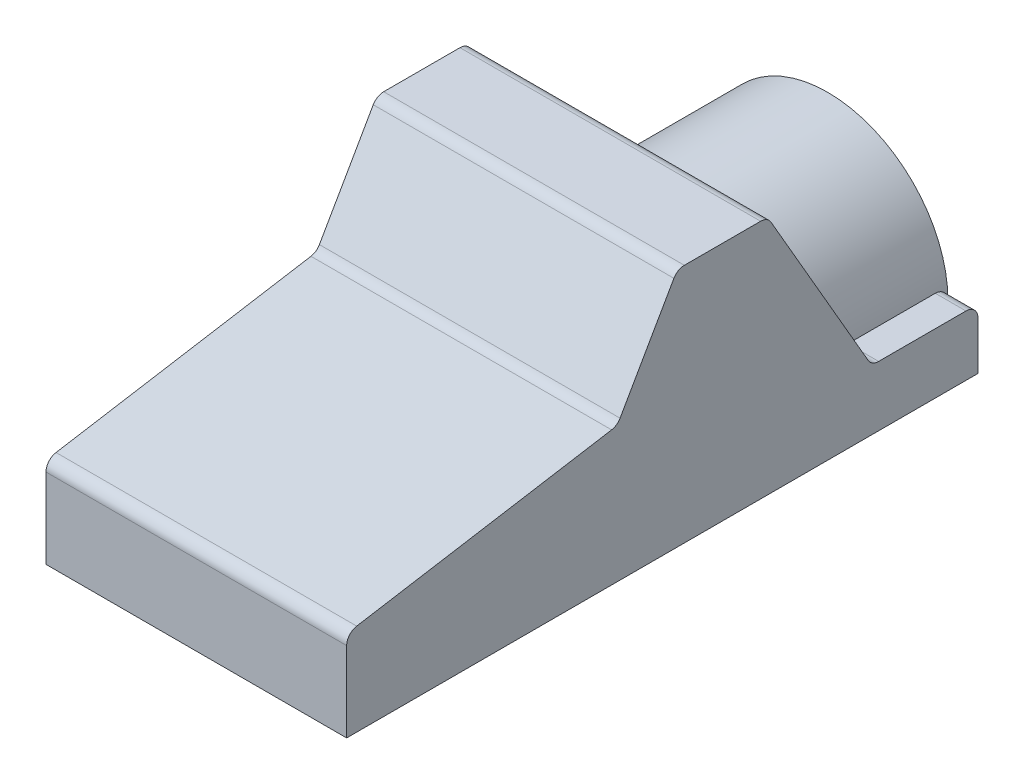
ISO-10303-21;
HEADER;
FILE_DESCRIPTION(('STEP AP214'),'2;1');
FILE_NAME('part.step','',(''),(''),'','','');
FILE_SCHEMA(('AUTOMOTIVE_DESIGN { 1 0 10303 214 1 1 1 1 }'));
ENDSEC;
DATA;
#1=APPLICATION_CONTEXT('core data for automotive mechanical design processes');
#2=APPLICATION_PROTOCOL_DEFINITION('international standard','automotive_design',2000,#1);
#3=PRODUCT_CONTEXT('',#1,'mechanical');
#4=PRODUCT('Part','Part','',(#3));
#5=PRODUCT_RELATED_PRODUCT_CATEGORY('part','',(#4));
#6=PRODUCT_DEFINITION_FORMATION('','',#4);
#7=PRODUCT_DEFINITION_CONTEXT('part definition',#1,'design');
#8=PRODUCT_DEFINITION('design','',#6,#7);
#9=PRODUCT_DEFINITION_SHAPE('','',#8);
#10=(LENGTH_UNIT() NAMED_UNIT(*) SI_UNIT(.MILLI.,.METRE.));
#11=(NAMED_UNIT(*) PLANE_ANGLE_UNIT() SI_UNIT($,.RADIAN.));
#12=(NAMED_UNIT(*) SI_UNIT($,.STERADIAN.) SOLID_ANGLE_UNIT());
#13=UNCERTAINTY_MEASURE_WITH_UNIT(LENGTH_MEASURE(1.E-05),#10,'distance_accuracy_value','');
#14=(GEOMETRIC_REPRESENTATION_CONTEXT(3) GLOBAL_UNCERTAINTY_ASSIGNED_CONTEXT((#13)) GLOBAL_UNIT_ASSIGNED_CONTEXT((#10,
#11,#12)) REPRESENTATION_CONTEXT('',''));
#15=CARTESIAN_POINT('',(0.,0.,0.));
#16=DIRECTION('',(0.,0.,1.));
#17=DIRECTION('',(1.,0.,0.));
#18=AXIS2_PLACEMENT_3D('',#15,#16,#17);
#19=CARTESIAN_POINT('',(31.75,10.16,2.54));
#20=DIRECTION('',(-1.,0.,0.));
#21=DIRECTION('',(0.,0.,1.));
#22=AXIS2_PLACEMENT_3D('',#19,#20,#21);
#23=CYLINDRICAL_SURFACE('',#22,2.54);
#24=CARTESIAN_POINT('',(-25.2726809025082,12.7,2.54000000000002));
#25=CARTESIAN_POINT('',(-25.2726779402194,12.7000070535808,2.46874814311628));
#26=CARTESIAN_POINT('',(-25.272982162978,12.697001914253,2.39749977324492));
#27=CARTESIAN_POINT('',(-25.2741830914852,12.6850218654408,2.25551632186813));
#28=CARTESIAN_POINT('',(-25.2750797578069,12.6760473532166,2.1847812065224));
#29=CARTESIAN_POINT('',(-25.2774425540141,12.6521946464252,2.04438856494622));
#30=CARTESIAN_POINT('',(-25.278908134911,12.6373221429764,1.97473006698459));
#31=CARTESIAN_POINT('',(-25.2823642824343,12.6017968371729,1.8369369881557));
#32=CARTESIAN_POINT('',(-25.2843548447254,12.5811440825519,1.76880239470893));
#33=CARTESIAN_POINT('',(-25.2910361747059,12.5106915632308,1.56735193202285));
#34=CARTESIAN_POINT('',(-25.296437844098,12.4523855981719,1.43691949043262));
#35=CARTESIAN_POINT('',(-25.3085235403602,12.3148476185671,1.18777671776236));
#36=CARTESIAN_POINT('',(-25.3152074408821,12.2356176655331,1.06906523347054));
#37=CARTESIAN_POINT('',(-25.3291315516561,12.0581623939293,0.846211688803077));
#38=CARTESIAN_POINT('',(-25.3363734271419,11.9598787747965,0.742116080324206));
#39=CARTESIAN_POINT('',(-25.3505834315214,11.7472150240316,0.551857559566727));
#40=CARTESIAN_POINT('',(-25.357551507343,11.6328317912181,0.465698110178693));
#41=CARTESIAN_POINT('',(-25.3704459991926,11.3909191202357,0.313589025124773));
#42=CARTESIAN_POINT('',(-25.3763699620825,11.2633598104814,0.247686720441549));
#43=CARTESIAN_POINT('',(-25.3864851734285,10.9989425884163,0.138289267813565));
#44=CARTESIAN_POINT('',(-25.3906774844195,10.8620904383678,0.094780375312849));
#45=CARTESIAN_POINT('',(-25.3958128817086,10.6303456040636,0.042131664572468));
#46=CARTESIAN_POINT('',(-25.3973754033214,10.5369227362637,0.026344012277897));
#47=CARTESIAN_POINT('',(-25.3994720977624,10.3490134177173,0.0052784017256253));
#48=CARTESIAN_POINT('',(-25.4000076237771,10.2545285317469,-1.33863719171967E-05));
#49=CARTESIAN_POINT('',(-25.4,10.1600000000023,0.));
#50=B_SPLINE_CURVE_WITH_KNOTS('',3,(#24,#25,#26,#27,#28,#29,#30,#31,#32,#33,#34,#35,#36,#37,#38,
#39,#40,#41,#42,#43,#44,#45,#46,#47,#48,#49),.UNSPECIFIED.,.F.,.F.,(4,2,2,2,2,2,2,2,2,2,2,2,4),
(0.,0.213685341530972,0.427356463783617,0.640821909172471,0.854285591798747,1.28100289232413,
1.7076781666901,2.13568020044609,2.56376479103253,2.99284213221161,3.42165580068431,
3.70538147614118,3.98873305240578),.UNSPECIFIED.);
#51=CARTESIAN_POINT('',(-25.2726809025083,12.7,2.54000000000002));
#52=VERTEX_POINT('',#51);
#53=CARTESIAN_POINT('',(-25.4,10.16,0.));
#54=VERTEX_POINT('',#53);
#55=EDGE_CURVE('E58',#52,#54,#50,.T.);
#56=ORIENTED_EDGE('',*,*,#55,.T.);
#57=DIRECTION('',(-1.,0.,0.));
#58=VECTOR('',#57,1.);
#59=CARTESIAN_POINT('',(31.75,10.16,0.));
#60=LINE('',#59,#58);
#61=CARTESIAN_POINT('',(-31.75,10.16,0.));
#62=VERTEX_POINT('',#61);
#63=EDGE_CURVE('E43',#54,#62,#60,.T.);
#64=ORIENTED_EDGE('',*,*,#63,.T.);
#65=CARTESIAN_POINT('',(-31.75,10.16,2.54));
#66=DIRECTION('',(1.,0.,0.));
#67=DIRECTION('',(0.,0.,1.));
#68=AXIS2_PLACEMENT_3D('',#65,#66,#67);
#69=CIRCLE('',#68,2.54);
#70=CARTESIAN_POINT('',(-31.75,12.7,2.54000000000002));
#71=VERTEX_POINT('',#70);
#72=EDGE_CURVE('E273',#62,#71,#69,.T.);
#73=ORIENTED_EDGE('',*,*,#72,.T.);
#74=DIRECTION('',(-1.,0.,0.));
#75=VECTOR('',#74,1.);
#76=CARTESIAN_POINT('',(31.75,12.7,2.54000000000002));
#77=LINE('',#76,#75);
#78=EDGE_CURVE('E337',#52,#71,#77,.T.);
#79=ORIENTED_EDGE('',*,*,#78,.F.);
#80=EDGE_LOOP('',(#56,#64,#73,#79));
#81=FACE_BOUND('',#80,.T.);
#82=ADVANCED_FACE('F35',(#81),#23,.T.);
#83=CARTESIAN_POINT('',(25.4,10.16,1.13686837721616E-10));
#84=CARTESIAN_POINT('',(25.4000029041256,10.2312527595916,-7.05136981985614E-06));
#85=CARTESIAN_POINT('',(25.3997002410352,10.3025020371802,0.00299816193891182));
#86=CARTESIAN_POINT('',(25.3985052397145,10.4444873546562,0.0149785211974774));
#87=CARTESIAN_POINT('',(25.397612940532,10.5152234282162,0.0239532718235815));
#88=CARTESIAN_POINT('',(25.3952612511361,10.6556181661879,0.0478066594453078));
#89=CARTESIAN_POINT('',(25.3938024065169,10.7252778003255,0.0626796166440172));
#90=CARTESIAN_POINT('',(25.3903613242141,10.8630731646098,0.0982060494917684));
#91=CARTESIAN_POINT('',(25.3883790908946,10.931208907458,0.118859476941768));
#92=CARTESIAN_POINT('',(25.3817237401902,11.1326629905969,0.189314439298341));
#93=CARTESIAN_POINT('',(25.3763407245307,11.263097861003,0.247622562560803));
#94=CARTESIAN_POINT('',(25.364286916402,11.5122446216883,0.385165582038816));
#95=CARTESIAN_POINT('',(25.3576162520292,11.6309576762897,0.464398396936364));
#96=CARTESIAN_POINT('',(25.3437076938814,11.8538093443061,0.641856540570134));
#97=CARTESIAN_POINT('',(25.3364681187626,11.9579020133159,0.740139528731666));
#98=CARTESIAN_POINT('',(25.3222505101081,12.148154892981,0.952800816671689));
#99=CARTESIAN_POINT('',(25.3152725275001,12.2343116265302,1.06718223014157));
#100=CARTESIAN_POINT('',(25.3023501524618,12.386417887894,1.309093341935));
#101=CARTESIAN_POINT('',(25.2964082208908,12.4523195808087,1.43665322884005));
#102=CARTESIAN_POINT('',(25.2862571164888,12.5617157131856,1.70107163864837));
#103=CARTESIAN_POINT('',(25.2820468795781,12.6052239169871,1.83792439091536));
#104=CARTESIAN_POINT('',(25.276888361206,12.6578706586825,2.06966731572696));
#105=CARTESIAN_POINT('',(25.2753183798298,12.6736574209172,2.16308751269988));
#106=CARTESIAN_POINT('',(25.2732114370872,12.6947218795017,2.35099162688311));
#107=CARTESIAN_POINT('',(25.2726731177989,12.7000133905136,2.44547398093682));
#108=CARTESIAN_POINT('',(25.2726809025081,12.7,2.54000000000002));
#109=B_SPLINE_CURVE_WITH_KNOTS('',3,(#83,#84,#85,#86,#87,#88,#89,#90,#91,#92,#93,#94,#95,#96,
#97,#98,#99,#100,#101,#102,#103,#104,#105,#106,#107,#108),.UNSPECIFIED.,.F.,.F.,(4,2,2,2,2,2,2,
2,2,2,2,2,4),(0.,0.213688061908641,0.427361974051956,0.640830622295291,0.854297490635361,
1.28102180761345,1.70770369554527,2.13569778340767,2.56377476618378,2.99285507491471,
3.42167133004881,3.70538903319309,3.98873303663722),.UNSPECIFIED.);
#110=CARTESIAN_POINT('',(25.4,10.16,0.));
#111=VERTEX_POINT('',#110);
#112=CARTESIAN_POINT('',(25.2726809025083,12.7,2.54000000000002));
#113=VERTEX_POINT('',#112);
#114=EDGE_CURVE('E216',#111,#113,#109,.T.);
#115=ORIENTED_EDGE('',*,*,#114,.T.);
#116=CARTESIAN_POINT('',(31.75,12.7,2.54000000000002));
#117=VERTEX_POINT('',#116);
#118=EDGE_CURVE('E338',#117,#113,#77,.T.);
#119=ORIENTED_EDGE('',*,*,#118,.F.);
#120=CARTESIAN_POINT('',(31.75,10.16,2.54));
#121=DIRECTION('',(1.,0.,0.));
#122=DIRECTION('',(0.,0.,1.));
#123=AXIS2_PLACEMENT_3D('',#120,#121,#122);
#124=CIRCLE('',#123,2.54);
#125=CARTESIAN_POINT('',(31.75,10.16,0.));
#126=VERTEX_POINT('',#125);
#127=EDGE_CURVE('E244',#126,#117,#124,.T.);
#128=ORIENTED_EDGE('',*,*,#127,.F.);
#129=EDGE_CURVE('E11',#126,#111,#60,.T.);
#130=ORIENTED_EDGE('',*,*,#129,.T.);
#131=EDGE_LOOP('',(#115,#119,#128,#130));
#132=FACE_BOUND('',#131,.T.);
#133=ADVANCED_FACE('F392',(#132),#23,.T.);
#134=CARTESIAN_POINT('',(31.75,12.7,20.9864850601335));
#135=DIRECTION('',(0.,-1.,0.));
#136=DIRECTION('',(0.,0.,-1.));
#137=AXIS2_PLACEMENT_3D('',#134,#135,#136);
#138=PLANE('',#137);
#139=DIRECTION('',(0.,0.,-1.));
#140=VECTOR('',#139,1.);
#141=CARTESIAN_POINT('',(-25.2726809025083,12.7,500000.));
#142=LINE('',#141,#140);
#143=CARTESIAN_POINT('',(-25.2726809025082,12.7,20.9864850601335));
#144=VERTEX_POINT('',#143);
#145=EDGE_CURVE('E239',#144,#52,#142,.T.);
#146=ORIENTED_EDGE('',*,*,#145,.T.);
#147=ORIENTED_EDGE('',*,*,#78,.T.);
#148=DIRECTION('',(0.,0.,1.));
#149=VECTOR('',#148,1.);
#150=CARTESIAN_POINT('',(-31.75,12.7,20.9864850601335));
#151=LINE('',#150,#149);
#152=CARTESIAN_POINT('',(-31.75,12.7,20.9864850601335));
#153=VERTEX_POINT('',#152);
#154=EDGE_CURVE('E276',#71,#153,#151,.T.);
#155=ORIENTED_EDGE('',*,*,#154,.T.);
#156=DIRECTION('',(-1.,0.,0.));
#157=VECTOR('',#156,1.);
#158=CARTESIAN_POINT('',(31.75,12.7,20.9864850601335));
#159=LINE('',#158,#157);
#160=EDGE_CURVE('E334',#144,#153,#159,.T.);
#161=ORIENTED_EDGE('',*,*,#160,.F.);
#162=EDGE_LOOP('',(#146,#147,#155,#161));
#163=FACE_BOUND('',#162,.T.);
#164=ADVANCED_FACE('F345',(#163),#138,.F.);
#165=DIRECTION('',(0.,0.,-1.));
#166=VECTOR('',#165,1.);
#167=CARTESIAN_POINT('',(25.2726809025083,12.7,500000.));
#168=LINE('',#167,#166);
#169=CARTESIAN_POINT('',(25.2726809025081,12.7,20.9864850601335));
#170=VERTEX_POINT('',#169);
#171=EDGE_CURVE('E223',#113,#170,#168,.F.);
#172=ORIENTED_EDGE('',*,*,#171,.T.);
#173=CARTESIAN_POINT('',(31.75,12.7,20.9864850601335));
#174=VERTEX_POINT('',#173);
#175=EDGE_CURVE('E335',#174,#170,#159,.T.);
#176=ORIENTED_EDGE('',*,*,#175,.F.);
#177=DIRECTION('',(0.,0.,1.));
#178=VECTOR('',#177,1.);
#179=CARTESIAN_POINT('',(31.75,12.7,20.9864850601335));
#180=LINE('',#179,#178);
#181=EDGE_CURVE('E247',#117,#174,#180,.T.);
#182=ORIENTED_EDGE('',*,*,#181,.F.);
#183=ORIENTED_EDGE('',*,*,#118,.T.);
#184=EDGE_LOOP('',(#172,#176,#182,#183));
#185=FACE_BOUND('',#184,.T.);
#186=ADVANCED_FACE('F378',(#185),#138,.F.);
#187=CARTESIAN_POINT('',(31.75,15.24,20.9864850601335));
#188=DIRECTION('',(-1.,0.,0.));
#189=DIRECTION('',(0.,0.,1.));
#190=AXIS2_PLACEMENT_3D('',#187,#188,#189);
#191=CYLINDRICAL_SURFACE('',#190,2.54000000000001);
#192=CARTESIAN_POINT('',(25.2726809025081,12.7,20.9864850601335));
#193=CARTESIAN_POINT('',(25.272679372482,12.6999929667407,21.0575957977798));
#194=CARTESIAN_POINT('',(25.2723807175574,12.7029862242433,21.1287033295036));
#195=CARTESIAN_POINT('',(25.2711783320703,12.7149190912014,21.2704092616155));
#196=CARTESIAN_POINT('',(25.2702746303878,12.723858416839,21.3410076861417));
#197=CARTESIAN_POINT('',(25.2678527680883,12.7476150687372,21.481116225609));
#198=CARTESIAN_POINT('',(25.2663353393233,12.762425393582,21.5506275347181));
#199=CARTESIAN_POINT('',(25.2626665535577,12.7978005281715,21.6881320699448));
#200=CARTESIAN_POINT('',(25.2605152057797,12.8183652541976,21.7561253181327));
#201=CARTESIAN_POINT('',(25.2530685449512,12.8885120157128,21.9571577170771));
#202=CARTESIAN_POINT('',(25.2467794403351,12.9465589091191,22.0873214676744));
#203=CARTESIAN_POINT('',(25.2312903484243,13.0834735385556,22.3359932830986));
#204=CARTESIAN_POINT('',(25.2220890917263,13.1623503518332,22.4544962354131));
#205=CARTESIAN_POINT('',(25.2004736927965,13.3386821055071,22.6766723168046));
#206=CARTESIAN_POINT('',(25.188055424548,13.4361608614503,22.7803261338418));
#207=CARTESIAN_POINT('',(25.1597849242001,13.6466028211113,22.9695720553476));
#208=CARTESIAN_POINT('',(25.1439400299812,13.7595327502776,23.05520199522));
#209=CARTESIAN_POINT('',(25.1218860667496,13.9085719505435,23.1498599906749));
#210=CARTESIAN_POINT('',(25.1173115697166,13.9391096494942,23.1683604968745));
#211=CARTESIAN_POINT('',(25.1126243152722,13.97,23.186189585746));
#212=B_SPLINE_CURVE_WITH_KNOTS('',3,(#192,#193,#194,#195,#196,#197,#198,#199,#200,#201,#202,
#203,#204,#205,#206,#207,#208,#209,#210,#211),.UNSPECIFIED.,.F.,.F.,(4,2,2,2,2,2,2,2,2,4),(0.,
0.21326283565008,0.426515492559222,0.639514598003226,0.852510604763713,1.2782863948309,
1.70424803622173,2.13075872817374,2.5563649649047,2.66431826126563),.UNSPECIFIED.);
#213=CARTESIAN_POINT('',(25.1126243152751,13.97,23.186189585746));
#214=VERTEX_POINT('',#213);
#215=EDGE_CURVE('E365',#170,#214,#212,.T.);
#216=ORIENTED_EDGE('',*,*,#215,.T.);
#217=DIRECTION('',(-1.,0.,0.));
#218=VECTOR('',#217,1.);
#219=CARTESIAN_POINT('',(31.75,13.97,23.186189585746));
#220=LINE('',#219,#218);
#221=CARTESIAN_POINT('',(31.75,13.97,23.186189585746));
#222=VERTEX_POINT('',#221);
#223=EDGE_CURVE('E332',#222,#214,#220,.T.);
#224=ORIENTED_EDGE('',*,*,#223,.F.);
#225=CARTESIAN_POINT('',(31.75,15.24,20.9864850601335));
#226=DIRECTION('',(-1.,0.,0.));
#227=DIRECTION('',(0.,0.,-1.));
#228=AXIS2_PLACEMENT_3D('',#225,#226,#227);
#229=CIRCLE('',#228,2.54000000000001);
#230=EDGE_CURVE('E249',#174,#222,#229,.T.);
#231=ORIENTED_EDGE('',*,*,#230,.F.);
#232=ORIENTED_EDGE('',*,*,#175,.T.);
#233=EDGE_LOOP('',(#216,#224,#231,#232));
#234=FACE_BOUND('',#233,.T.);
#235=ADVANCED_FACE('F380',(#234),#191,.F.);
#236=CARTESIAN_POINT('',(-25.1126243152722,13.97,23.186189585746));
#237=CARTESIAN_POINT('',(-25.1219277692736,13.9086877141201,23.1507995013809));
#238=CARTESIAN_POINT('',(-25.1307806751462,13.8488129937848,23.1128047383761));
#239=CARTESIAN_POINT('',(-25.1475974760667,13.7323639417003,23.0318826351158));
#240=CARTESIAN_POINT('',(-25.1555613810366,13.6757895731195,22.9889553499223));
#241=CARTESIAN_POINT('',(-25.1706044376718,13.5664235108533,22.8984924995192));
#242=CARTESIAN_POINT('',(-25.1776845249135,13.5136278428833,22.8509619035277));
#243=CARTESIAN_POINT('',(-25.1909919215348,13.412160000668,22.7516054322131));
#244=CARTESIAN_POINT('',(-25.1972192533234,13.3634877180804,22.6997796698166));
#245=CARTESIAN_POINT('',(-25.2146717803036,13.2241618565154,22.5383115633698));
#246=CARTESIAN_POINT('',(-25.224672380109,13.140163085026,22.4226484528388));
#247=CARTESIAN_POINT('',(-25.2416630388722,12.9926666571609,22.1787262735677));
#248=CARTESIAN_POINT('',(-25.2486518384073,12.9291775799485,22.0504619629517));
#249=CARTESIAN_POINT('',(-25.2598909995741,12.8247068856597,21.7853640492905));
#250=CARTESIAN_POINT('',(-25.2641486078523,12.7836657506937,21.6485541887044));
#251=CARTESIAN_POINT('',(-25.2701600626317,12.7251344121751,21.3701560701815));
#252=CARTESIAN_POINT('',(-25.2719194497903,12.7075920968869,21.2285791016704));
#253=CARTESIAN_POINT('',(-25.27261445261,12.7006565009453,21.0533111526846));
#254=CARTESIAN_POINT('',(-25.2726805546002,12.6999960208731,21.0198914094065));
#255=CARTESIAN_POINT('',(-25.2726809025081,12.7,20.9864850601335));
#256=B_SPLINE_CURVE_WITH_KNOTS('',3,(#236,#237,#238,#239,#240,#241,#242,#243,#244,#245,#246,
#247,#248,#249,#250,#251,#252,#253,#254,#255),.UNSPECIFIED.,.F.,.F.,(4,2,2,2,2,2,2,2,2,4),(0.,
0.214138374953271,0.428274359696158,0.642181710483965,0.856083439095227,1.28374703572686,
1.71158929222376,2.13829161114843,2.56404608606335,2.66429572058692),.UNSPECIFIED.);
#257=CARTESIAN_POINT('',(-25.1126243152751,13.97,23.186189585746));
#258=VERTEX_POINT('',#257);
#259=EDGE_CURVE('E360',#258,#144,#256,.T.);
#260=ORIENTED_EDGE('',*,*,#259,.T.);
#261=ORIENTED_EDGE('',*,*,#160,.T.);
#262=CARTESIAN_POINT('',(-31.75,15.24,20.9864850601335));
#263=DIRECTION('',(-1.,0.,0.));
#264=DIRECTION('',(0.,0.,-1.));
#265=AXIS2_PLACEMENT_3D('',#262,#263,#264);
#266=CIRCLE('',#265,2.54000000000001);
#267=CARTESIAN_POINT('',(-31.75,13.97,23.186189585746));
#268=VERTEX_POINT('',#267);
#269=EDGE_CURVE('E279',#153,#268,#266,.T.);
#270=ORIENTED_EDGE('',*,*,#269,.T.);
#271=EDGE_CURVE('E331',#258,#268,#220,.T.);
#272=ORIENTED_EDGE('',*,*,#271,.F.);
#273=EDGE_LOOP('',(#260,#261,#270,#272));
#274=FACE_BOUND('',#273,.T.);
#275=ADVANCED_FACE('F358',(#274),#191,.F.);
#276=CARTESIAN_POINT('',(31.75,10.16,0.));
#277=DIRECTION('',(0.,0.,1.));
#278=DIRECTION('',(0.,-1.,0.));
#279=AXIS2_PLACEMENT_3D('',#276,#277,#278);
#280=PLANE('',#279);
#281=DIRECTION('',(-1.,0.,0.));
#282=VECTOR('',#281,1.);
#283=CARTESIAN_POINT('',(31.75,0.,0.));
#284=LINE('',#283,#282);
#285=CARTESIAN_POINT('',(31.75,0.,0.));
#286=VERTEX_POINT('',#285);
#287=CARTESIAN_POINT('',(12.7,0.,0.));
#288=VERTEX_POINT('',#287);
#289=EDGE_CURVE('E301',#286,#288,#284,.T.);
#290=ORIENTED_EDGE('',*,*,#289,.T.);
#291=DIRECTION('',(0.,-1.,0.));
#292=VECTOR('',#291,1.);
#293=CARTESIAN_POINT('',(12.7,12.7,0.));
#294=LINE('',#293,#292);
#295=CARTESIAN_POINT('',(12.7,12.7,0.));
#296=VERTEX_POINT('',#295);
#297=EDGE_CURVE('E613',#296,#288,#294,.T.);
#298=ORIENTED_EDGE('',*,*,#297,.F.);
#299=CARTESIAN_POINT('',(0.,12.7,0.));
#300=DIRECTION('',(0.,0.,-1.));
#301=DIRECTION('',(0.,1.,0.));
#302=AXIS2_PLACEMENT_3D('',#299,#300,#301);
#303=CIRCLE('',#302,12.7);
#304=CARTESIAN_POINT('',(-12.7,12.7,0.));
#305=VERTEX_POINT('',#304);
#306=EDGE_CURVE('E609',#305,#296,#303,.T.);
#307=ORIENTED_EDGE('',*,*,#306,.F.);
#308=DIRECTION('',(0.,1.,0.));
#309=VECTOR('',#308,1.);
#310=CARTESIAN_POINT('',(-12.7,0.,0.));
#311=LINE('',#310,#309);
#312=CARTESIAN_POINT('',(-12.7,0.,0.));
#313=VERTEX_POINT('',#312);
#314=EDGE_CURVE('E611',#313,#305,#311,.T.);
#315=ORIENTED_EDGE('',*,*,#314,.F.);
#316=CARTESIAN_POINT('',(-31.75,0.,0.));
#317=VERTEX_POINT('',#316);
#318=EDGE_CURVE('E204',#313,#317,#284,.T.);
#319=ORIENTED_EDGE('',*,*,#318,.T.);
#320=DIRECTION('',(0.,1.,0.));
#321=VECTOR('',#320,1.);
#322=CARTESIAN_POINT('',(-31.75,10.16,0.));
#323=LINE('',#322,#321);
#324=EDGE_CURVE('E215',#317,#62,#323,.T.);
#325=ORIENTED_EDGE('',*,*,#324,.T.);
#326=ORIENTED_EDGE('',*,*,#63,.F.);
#327=CARTESIAN_POINT('',(0.,10.16,0.));
#328=DIRECTION('',(0.,0.,-1.));
#329=DIRECTION('',(0.,1.,0.));
#330=AXIS2_PLACEMENT_3D('',#327,#328,#329);
#331=CIRCLE('',#330,25.4);
#332=EDGE_CURVE('E212',#111,#54,#331,.F.);
#333=ORIENTED_EDGE('',*,*,#332,.F.);
#334=ORIENTED_EDGE('',*,*,#129,.F.);
#335=DIRECTION('',(0.,1.,0.));
#336=VECTOR('',#335,1.);
#337=CARTESIAN_POINT('',(31.75,10.16,0.));
#338=LINE('',#337,#336);
#339=EDGE_CURVE('E241',#286,#126,#338,.T.);
#340=ORIENTED_EDGE('',*,*,#339,.F.);
#341=EDGE_LOOP('',(#290,#298,#307,#315,#319,#325,#326,#333,#334,#340));
#342=FACE_BOUND('',#341,.T.);
#343=ADVANCED_FACE('F37',(#342),#280,.F.);
#344=CARTESIAN_POINT('',(31.75,49.53,43.7167651581292));
#345=DIRECTION('',(0.,-0.500000000000001,0.866025403784438));
#346=DIRECTION('',(0.,-0.866025403784438,-0.500000000000001));
#347=AXIS2_PLACEMENT_3D('',#344,#345,#346);
#348=PLANE('',#347);
#349=CARTESIAN_POINT('',(0.,10.16,20.9864850601775));
#350=DIRECTION('',(0.,-0.500000000000001,0.866025403784438));
#351=DIRECTION('',(0.,-0.866025403784438,-0.500000000000001));
#352=AXIS2_PLACEMENT_3D('',#349,#350,#351);
#353=ELLIPSE('',#352,29.329393674833,25.4);
#354=EDGE_CURVE('E364',#214,#258,#353,.T.);
#355=ORIENTED_EDGE('',*,*,#354,.T.);
#356=ORIENTED_EDGE('',*,*,#271,.T.);
#357=DIRECTION('',(0.,0.866025403784438,0.500000000000001));
#358=VECTOR('',#357,1.);
#359=CARTESIAN_POINT('',(-31.75,49.53,43.7167651581292));
#360=LINE('',#359,#358);
#361=CARTESIAN_POINT('',(-31.75,49.53,43.7167651581292));
#362=VERTEX_POINT('',#361);
#363=EDGE_CURVE('E282',#268,#362,#360,.T.);
#364=ORIENTED_EDGE('',*,*,#363,.T.);
#365=DIRECTION('',(-1.,0.,0.));
#366=VECTOR('',#365,1.);
#367=CARTESIAN_POINT('',(31.75,49.53,43.7167651581292));
#368=LINE('',#367,#366);
#369=CARTESIAN_POINT('',(31.75,49.53,43.7167651581292));
#370=VERTEX_POINT('',#369);
#371=EDGE_CURVE('E328',#370,#362,#368,.T.);
#372=ORIENTED_EDGE('',*,*,#371,.F.);
#373=DIRECTION('',(0.,0.866025403784438,0.500000000000001));
#374=VECTOR('',#373,1.);
#375=CARTESIAN_POINT('',(31.75,49.53,43.7167651581292));
#376=LINE('',#375,#374);
#377=EDGE_CURVE('E251',#222,#370,#376,.T.);
#378=ORIENTED_EDGE('',*,*,#377,.F.);
#379=ORIENTED_EDGE('',*,*,#223,.T.);
#380=EDGE_LOOP('',(#355,#356,#364,#372,#378,#379));
#381=FACE_BOUND('',#380,.T.);
#382=ADVANCED_FACE('F382',(#381),#348,.F.);
#383=CARTESIAN_POINT('',(31.75,48.26,45.9164696837416));
#384=DIRECTION('',(-1.,0.,0.));
#385=DIRECTION('',(0.,0.,1.));
#386=AXIS2_PLACEMENT_3D('',#383,#384,#385);
#387=CYLINDRICAL_SURFACE('',#386,2.54000000000001);
#388=CARTESIAN_POINT('',(-31.75,48.26,45.9164696837416));
#389=DIRECTION('',(1.,0.,0.));
#390=DIRECTION('',(0.,0.,1.));
#391=AXIS2_PLACEMENT_3D('',#388,#389,#390);
#392=CIRCLE('',#391,2.54000000000001);
#393=CARTESIAN_POINT('',(-31.75,50.8,45.9164696837416));
#394=VERTEX_POINT('',#393);
#395=EDGE_CURVE('E284',#362,#394,#392,.T.);
#396=ORIENTED_EDGE('',*,*,#395,.T.);
#397=DIRECTION('',(-1.,0.,0.));
#398=VECTOR('',#397,1.);
#399=CARTESIAN_POINT('',(31.75,50.8,45.9164696837416));
#400=LINE('',#399,#398);
#401=CARTESIAN_POINT('',(31.75,50.8,45.9164696837416));
#402=VERTEX_POINT('',#401);
#403=EDGE_CURVE('E325',#402,#394,#400,.T.);
#404=ORIENTED_EDGE('',*,*,#403,.F.);
#405=CARTESIAN_POINT('',(31.75,48.26,45.9164696837416));
#406=DIRECTION('',(1.,0.,0.));
#407=DIRECTION('',(0.,0.,1.));
#408=AXIS2_PLACEMENT_3D('',#405,#406,#407);
#409=CIRCLE('',#408,2.54000000000001);
#410=EDGE_CURVE('E253',#370,#402,#409,.T.);
#411=ORIENTED_EDGE('',*,*,#410,.F.);
#412=ORIENTED_EDGE('',*,*,#371,.T.);
#413=EDGE_LOOP('',(#396,#404,#411,#412));
#414=FACE_BOUND('',#413,.T.);
#415=ADVANCED_FACE('F434',(#414),#387,.T.);
#416=CARTESIAN_POINT('',(31.75,50.8,62.0259807599031));
#417=DIRECTION('',(0.,-1.,0.));
#418=DIRECTION('',(0.,0.,-1.));
#419=AXIS2_PLACEMENT_3D('',#416,#417,#418);
#420=PLANE('',#419);
#421=DIRECTION('',(0.,0.,1.));
#422=VECTOR('',#421,1.);
#423=CARTESIAN_POINT('',(-31.75,50.8,62.0259807599031));
#424=LINE('',#423,#422);
#425=CARTESIAN_POINT('',(-31.75,50.8,62.0259807599031));
#426=VERTEX_POINT('',#425);
#427=EDGE_CURVE('E286',#394,#426,#424,.T.);
#428=ORIENTED_EDGE('',*,*,#427,.T.);
#429=DIRECTION('',(-1.,0.,0.));
#430=VECTOR('',#429,1.);
#431=CARTESIAN_POINT('',(31.75,50.8,62.0259807599031));
#432=LINE('',#431,#430);
#433=CARTESIAN_POINT('',(31.75,50.8,62.0259807599031));
#434=VERTEX_POINT('',#433);
#435=EDGE_CURVE('E322',#434,#426,#432,.T.);
#436=ORIENTED_EDGE('',*,*,#435,.F.);
#437=DIRECTION('',(0.,0.,1.));
#438=VECTOR('',#437,1.);
#439=CARTESIAN_POINT('',(31.75,50.8,62.0259807599031));
#440=LINE('',#439,#438);
#441=EDGE_CURVE('E255',#402,#434,#440,.T.);
#442=ORIENTED_EDGE('',*,*,#441,.F.);
#443=ORIENTED_EDGE('',*,*,#403,.T.);
#444=EDGE_LOOP('',(#428,#436,#442,#443));
#445=FACE_BOUND('',#444,.T.);
#446=ADVANCED_FACE('F432',(#445),#420,.F.);
#447=CARTESIAN_POINT('',(31.75,48.26,62.0259807599031));
#448=DIRECTION('',(-1.,0.,0.));
#449=DIRECTION('',(0.,0.,1.));
#450=AXIS2_PLACEMENT_3D('',#447,#448,#449);
#451=CYLINDRICAL_SURFACE('',#450,2.54);
#452=CARTESIAN_POINT('',(-31.75,48.26,62.0259807599031));
#453=DIRECTION('',(1.,0.,0.));
#454=DIRECTION('',(0.,0.,1.));
#455=AXIS2_PLACEMENT_3D('',#452,#453,#454);
#456=CIRCLE('',#455,2.54);
#457=CARTESIAN_POINT('',(-31.75,49.5201929034263,64.2313183408992));
#458=VERTEX_POINT('',#457);
#459=EDGE_CURVE('E288',#426,#458,#456,.T.);
#460=ORIENTED_EDGE('',*,*,#459,.T.);
#461=DIRECTION('',(-1.,0.,0.));
#462=VECTOR('',#461,1.);
#463=CARTESIAN_POINT('',(31.75,49.5201929034263,64.2313183408992));
#464=LINE('',#463,#462);
#465=CARTESIAN_POINT('',(31.75,49.5201929034263,64.2313183408992));
#466=VERTEX_POINT('',#465);
#467=EDGE_CURVE('E319',#466,#458,#464,.T.);
#468=ORIENTED_EDGE('',*,*,#467,.F.);
#469=CARTESIAN_POINT('',(31.75,48.26,62.0259807599031));
#470=DIRECTION('',(1.,0.,0.));
#471=DIRECTION('',(0.,0.,1.));
#472=AXIS2_PLACEMENT_3D('',#469,#470,#471);
#473=CIRCLE('',#472,2.54);
#474=EDGE_CURVE('E257',#434,#466,#473,.T.);
#475=ORIENTED_EDGE('',*,*,#474,.F.);
#476=ORIENTED_EDGE('',*,*,#435,.T.);
#477=EDGE_LOOP('',(#460,#468,#475,#476));
#478=FACE_BOUND('',#477,.T.);
#479=ADVANCED_FACE('F427',(#478),#451,.T.);
#480=CARTESIAN_POINT('',(31.75,29.6220013888901,75.6017134920628));
#481=DIRECTION('',(0.,-0.496138938356833,-0.86824314212446));
#482=DIRECTION('',(0.,0.86824314212446,-0.496138938356833));
#483=AXIS2_PLACEMENT_3D('',#480,#481,#482);
#484=PLANE('',#483);
#485=DIRECTION('',(0.,-0.868243142124459,0.496138938356833));
#486=VECTOR('',#485,1.);
#487=CARTESIAN_POINT('',(-31.75,29.6220013888901,75.6017134920628));
#488=LINE('',#487,#486);
#489=CARTESIAN_POINT('',(-31.75,29.6220013888901,75.6017134920628));
#490=VERTEX_POINT('',#489);
#491=EDGE_CURVE('E290',#458,#490,#488,.T.);
#492=ORIENTED_EDGE('',*,*,#491,.T.);
#493=DIRECTION('',(-1.,0.,0.));
#494=VECTOR('',#493,1.);
#495=CARTESIAN_POINT('',(31.75,29.6220013888901,75.6017134920628));
#496=LINE('',#495,#494);
#497=CARTESIAN_POINT('',(31.75,29.6220013888901,75.6017134920628));
#498=VERTEX_POINT('',#497);
#499=EDGE_CURVE('E316',#498,#490,#496,.T.);
#500=ORIENTED_EDGE('',*,*,#499,.F.);
#501=DIRECTION('',(0.,-0.868243142124459,0.496138938356833));
#502=VECTOR('',#501,1.);
#503=CARTESIAN_POINT('',(31.75,29.6220013888901,75.6017134920628));
#504=LINE('',#503,#502);
#505=EDGE_CURVE('E259',#466,#498,#504,.T.);
#506=ORIENTED_EDGE('',*,*,#505,.F.);
#507=ORIENTED_EDGE('',*,*,#467,.T.);
#508=EDGE_LOOP('',(#492,#500,#506,#507));
#509=FACE_BOUND('',#508,.T.);
#510=ADVANCED_FACE('F422',(#509),#484,.F.);
#511=CARTESIAN_POINT('',(31.75,30.8821942923164,77.8070510730589));
#512=DIRECTION('',(-1.,0.,0.));
#513=DIRECTION('',(0.,0.,1.));
#514=AXIS2_PLACEMENT_3D('',#511,#512,#513);
#515=CYLINDRICAL_SURFACE('',#514,2.54);
#516=CARTESIAN_POINT('',(-31.75,30.8821942923164,77.8070510730589));
#517=DIRECTION('',(-1.,0.,0.));
#518=DIRECTION('',(0.,0.,-1.));
#519=AXIS2_PLACEMENT_3D('',#516,#517,#518);
#520=CIRCLE('',#519,2.54);
#521=CARTESIAN_POINT('',(-31.75,28.3767537257828,77.3894776453033));
#522=VERTEX_POINT('',#521);
#523=EDGE_CURVE('E292',#490,#522,#520,.T.);
#524=ORIENTED_EDGE('',*,*,#523,.T.);
#525=DIRECTION('',(-1.,0.,0.));
#526=VECTOR('',#525,1.);
#527=CARTESIAN_POINT('',(31.75,28.3767537257828,77.3894776453033));
#528=LINE('',#527,#526);
#529=CARTESIAN_POINT('',(31.75,28.3767537257828,77.3894776453033));
#530=VERTEX_POINT('',#529);
#531=EDGE_CURVE('E313',#530,#522,#528,.T.);
#532=ORIENTED_EDGE('',*,*,#531,.F.);
#533=CARTESIAN_POINT('',(31.75,30.8821942923164,77.8070510730589));
#534=DIRECTION('',(-1.,0.,0.));
#535=DIRECTION('',(0.,0.,-1.));
#536=AXIS2_PLACEMENT_3D('',#533,#534,#535);
#537=CIRCLE('',#536,2.54);
#538=EDGE_CURVE('E261',#498,#530,#537,.T.);
#539=ORIENTED_EDGE('',*,*,#538,.F.);
#540=ORIENTED_EDGE('',*,*,#499,.T.);
#541=EDGE_LOOP('',(#524,#532,#539,#540));
#542=FACE_BOUND('',#541,.T.);
#543=ADVANCED_FACE('F418',(#542),#515,.F.);
#544=CARTESIAN_POINT('',(31.75,19.4037377620407,131.227573427756));
#545=DIRECTION('',(0.,-0.986393923832144,-0.164398987305357));
#546=DIRECTION('',(0.,0.164398987305357,-0.986393923832144));
#547=AXIS2_PLACEMENT_3D('',#544,#545,#546);
#548=PLANE('',#547);
#549=DIRECTION('',(0.,-0.164398987305357,0.986393923832144));
#550=VECTOR('',#549,1.);
#551=CARTESIAN_POINT('',(-31.75,19.4037377620407,131.227573427756));
#552=LINE('',#551,#550);
#553=CARTESIAN_POINT('',(-31.75,19.4037377620407,131.227573427756));
#554=VERTEX_POINT('',#553);
#555=EDGE_CURVE('E294',#522,#554,#552,.T.);
#556=ORIENTED_EDGE('',*,*,#555,.T.);
#557=DIRECTION('',(-1.,0.,0.));
#558=VECTOR('',#557,1.);
#559=CARTESIAN_POINT('',(31.75,19.4037377620407,131.227573427756));
#560=LINE('',#559,#558);
#561=CARTESIAN_POINT('',(31.75,19.4037377620407,131.227573427756));
#562=VERTEX_POINT('',#561);
#563=EDGE_CURVE('E310',#562,#554,#560,.T.);
#564=ORIENTED_EDGE('',*,*,#563,.F.);
#565=DIRECTION('',(0.,-0.164398987305357,0.986393923832144));
#566=VECTOR('',#565,1.);
#567=CARTESIAN_POINT('',(31.75,19.4037377620407,131.227573427756));
#568=LINE('',#567,#566);
#569=EDGE_CURVE('E263',#530,#562,#568,.T.);
#570=ORIENTED_EDGE('',*,*,#569,.F.);
#571=ORIENTED_EDGE('',*,*,#531,.T.);
#572=EDGE_LOOP('',(#556,#564,#570,#571));
#573=FACE_BOUND('',#572,.T.);
#574=ADVANCED_FACE('F413',(#573),#548,.F.);
#575=CARTESIAN_POINT('',(31.75,16.8982971955071,130.81));
#576=DIRECTION('',(-1.,0.,0.));
#577=DIRECTION('',(0.,0.,1.));
#578=AXIS2_PLACEMENT_3D('',#575,#576,#577);
#579=CYLINDRICAL_SURFACE('',#578,2.53999999999999);
#580=CARTESIAN_POINT('',(-31.75,16.8982971955071,130.81));
#581=DIRECTION('',(1.,0.,0.));
#582=DIRECTION('',(0.,0.,1.));
#583=AXIS2_PLACEMENT_3D('',#580,#581,#582);
#584=CIRCLE('',#583,2.53999999999999);
#585=CARTESIAN_POINT('',(-31.75,16.8982971955071,133.35));
#586=VERTEX_POINT('',#585);
#587=EDGE_CURVE('E296',#554,#586,#584,.T.);
#588=ORIENTED_EDGE('',*,*,#587,.T.);
#589=DIRECTION('',(-1.,0.,0.));
#590=VECTOR('',#589,1.);
#591=CARTESIAN_POINT('',(31.75,16.8982971955071,133.35));
#592=LINE('',#591,#590);
#593=CARTESIAN_POINT('',(31.75,16.8982971955071,133.35));
#594=VERTEX_POINT('',#593);
#595=EDGE_CURVE('E307',#594,#586,#592,.T.);
#596=ORIENTED_EDGE('',*,*,#595,.F.);
#597=CARTESIAN_POINT('',(31.75,16.8982971955071,130.81));
#598=DIRECTION('',(1.,0.,0.));
#599=DIRECTION('',(0.,0.,1.));
#600=AXIS2_PLACEMENT_3D('',#597,#598,#599);
#601=CIRCLE('',#600,2.53999999999999);
#602=EDGE_CURVE('E265',#562,#594,#601,.T.);
#603=ORIENTED_EDGE('',*,*,#602,.F.);
#604=ORIENTED_EDGE('',*,*,#563,.T.);
#605=EDGE_LOOP('',(#588,#596,#603,#604));
#606=FACE_BOUND('',#605,.T.);
#607=ADVANCED_FACE('F407',(#606),#579,.T.);
#608=CARTESIAN_POINT('',(31.75,0.,133.35));
#609=DIRECTION('',(0.,0.,-1.));
#610=DIRECTION('',(-1.,0.,0.));
#611=AXIS2_PLACEMENT_3D('',#608,#609,#610);
#612=PLANE('',#611);
#613=DIRECTION('',(0.,-1.,0.));
#614=VECTOR('',#613,1.);
#615=CARTESIAN_POINT('',(-31.75,0.,133.35));
#616=LINE('',#615,#614);
#617=CARTESIAN_POINT('',(-31.75,0.,133.35));
#618=VERTEX_POINT('',#617);
#619=EDGE_CURVE('E298',#586,#618,#616,.T.);
#620=ORIENTED_EDGE('',*,*,#619,.T.);
#621=DIRECTION('',(-1.,0.,0.));
#622=VECTOR('',#621,1.);
#623=CARTESIAN_POINT('',(31.75,0.,133.35));
#624=LINE('',#623,#622);
#625=CARTESIAN_POINT('',(31.75,0.,133.35));
#626=VERTEX_POINT('',#625);
#627=EDGE_CURVE('E304',#626,#618,#624,.T.);
#628=ORIENTED_EDGE('',*,*,#627,.F.);
#629=DIRECTION('',(0.,-1.,0.));
#630=VECTOR('',#629,1.);
#631=CARTESIAN_POINT('',(31.75,0.,133.35));
#632=LINE('',#631,#630);
#633=EDGE_CURVE('E267',#594,#626,#632,.T.);
#634=ORIENTED_EDGE('',*,*,#633,.F.);
#635=ORIENTED_EDGE('',*,*,#595,.T.);
#636=EDGE_LOOP('',(#620,#628,#634,#635));
#637=FACE_BOUND('',#636,.T.);
#638=ADVANCED_FACE('F403',(#637),#612,.F.);
#639=CARTESIAN_POINT('',(31.75,0.,0.));
#640=DIRECTION('',(0.,1.,0.));
#641=DIRECTION('',(0.,0.,1.));
#642=AXIS2_PLACEMENT_3D('',#639,#640,#641);
#643=PLANE('',#642);
#644=DIRECTION('',(-1.,0.,0.));
#645=VECTOR('',#644,1.);
#646=CARTESIAN_POINT('',(12.7,0.,53.975));
#647=LINE('',#646,#645);
#648=CARTESIAN_POINT('',(12.7,0.,53.975));
#649=VERTEX_POINT('',#648);
#650=CARTESIAN_POINT('',(-12.7,0.,53.975));
#651=VERTEX_POINT('',#650);
#652=EDGE_CURVE('E194',#649,#651,#647,.T.);
#653=ORIENTED_EDGE('',*,*,#652,.F.);
#654=DIRECTION('',(0.,0.,-1.));
#655=VECTOR('',#654,1.);
#656=CARTESIAN_POINT('',(12.7,0.,53.975));
#657=LINE('',#656,#655);
#658=EDGE_CURVE('E205',#649,#288,#657,.T.);
#659=ORIENTED_EDGE('',*,*,#658,.T.);
#660=ORIENTED_EDGE('',*,*,#289,.F.);
#661=DIRECTION('',(0.,0.,-1.));
#662=VECTOR('',#661,1.);
#663=CARTESIAN_POINT('',(31.75,0.,0.));
#664=LINE('',#663,#662);
#665=EDGE_CURVE('E269',#626,#286,#664,.T.);
#666=ORIENTED_EDGE('',*,*,#665,.F.);
#667=ORIENTED_EDGE('',*,*,#627,.T.);
#668=DIRECTION('',(0.,0.,-1.));
#669=VECTOR('',#668,1.);
#670=CARTESIAN_POINT('',(-31.75,0.,0.));
#671=LINE('',#670,#669);
#672=EDGE_CURVE('E245',#618,#317,#671,.T.);
#673=ORIENTED_EDGE('',*,*,#672,.T.);
#674=ORIENTED_EDGE('',*,*,#318,.F.);
#675=DIRECTION('',(0.,0.,-1.));
#676=VECTOR('',#675,1.);
#677=CARTESIAN_POINT('',(-12.7,0.,53.975));
#678=LINE('',#677,#676);
#679=EDGE_CURVE('E189',#651,#313,#678,.T.);
#680=ORIENTED_EDGE('',*,*,#679,.F.);
#681=EDGE_LOOP('',(#653,#659,#660,#666,#667,#673,#674,#680));
#682=FACE_BOUND('',#681,.T.);
#683=ADVANCED_FACE('F202',(#682),#643,.F.);
#684=CARTESIAN_POINT('',(31.75,16.8982971955071,130.81));
#685=DIRECTION('',(-1.,0.,0.));
#686=DIRECTION('',(0.,0.,1.));
#687=AXIS2_PLACEMENT_3D('',#684,#685,#686);
#688=PLANE('',#687);
#689=ORIENTED_EDGE('',*,*,#339,.T.);
#690=ORIENTED_EDGE('',*,*,#127,.T.);
#691=ORIENTED_EDGE('',*,*,#181,.T.);
#692=ORIENTED_EDGE('',*,*,#230,.T.);
#693=ORIENTED_EDGE('',*,*,#377,.T.);
#694=ORIENTED_EDGE('',*,*,#410,.T.);
#695=ORIENTED_EDGE('',*,*,#441,.T.);
#696=ORIENTED_EDGE('',*,*,#474,.T.);
#697=ORIENTED_EDGE('',*,*,#505,.T.);
#698=ORIENTED_EDGE('',*,*,#538,.T.);
#699=ORIENTED_EDGE('',*,*,#569,.T.);
#700=ORIENTED_EDGE('',*,*,#602,.T.);
#701=ORIENTED_EDGE('',*,*,#633,.T.);
#702=ORIENTED_EDGE('',*,*,#665,.T.);
#703=EDGE_LOOP('',(#689,#690,#691,#692,#693,#694,#695,#696,#697,#698,#699,#700,#701,#702));
#704=FACE_BOUND('',#703,.T.);
#705=ADVANCED_FACE('F387',(#704),#688,.F.);
#706=CARTESIAN_POINT('',(-31.75,16.8982971955071,130.81));
#707=DIRECTION('',(-1.,0.,0.));
#708=DIRECTION('',(0.,0.,1.));
#709=AXIS2_PLACEMENT_3D('',#706,#707,#708);
#710=PLANE('',#709);
#711=ORIENTED_EDGE('',*,*,#324,.F.);
#712=ORIENTED_EDGE('',*,*,#672,.F.);
#713=ORIENTED_EDGE('',*,*,#619,.F.);
#714=ORIENTED_EDGE('',*,*,#587,.F.);
#715=ORIENTED_EDGE('',*,*,#555,.F.);
#716=ORIENTED_EDGE('',*,*,#523,.F.);
#717=ORIENTED_EDGE('',*,*,#491,.F.);
#718=ORIENTED_EDGE('',*,*,#459,.F.);
#719=ORIENTED_EDGE('',*,*,#427,.F.);
#720=ORIENTED_EDGE('',*,*,#395,.F.);
#721=ORIENTED_EDGE('',*,*,#363,.F.);
#722=ORIENTED_EDGE('',*,*,#269,.F.);
#723=ORIENTED_EDGE('',*,*,#154,.F.);
#724=ORIENTED_EDGE('',*,*,#72,.F.);
#725=EDGE_LOOP('',(#711,#712,#713,#714,#715,#716,#717,#718,#719,#720,#721,#722,#723,#724));
#726=FACE_BOUND('',#725,.T.);
#727=ADVANCED_FACE('F353',(#726),#710,.T.);
#728=CARTESIAN_POINT('',(0.,10.1600000000016,500000.));
#729=DIRECTION('',(0.,0.,-1.));
#730=DIRECTION('',(0.,1.,0.));
#731=AXIS2_PLACEMENT_3D('',#728,#729,#730);
#732=CYLINDRICAL_SURFACE('',#731,25.4);
#733=ORIENTED_EDGE('',*,*,#114,.F.);
#734=ORIENTED_EDGE('',*,*,#332,.T.);
#735=ORIENTED_EDGE('',*,*,#55,.F.);
#736=ORIENTED_EDGE('',*,*,#145,.F.);
#737=ORIENTED_EDGE('',*,*,#259,.F.);
#738=ORIENTED_EDGE('',*,*,#354,.F.);
#739=ORIENTED_EDGE('',*,*,#215,.F.);
#740=ORIENTED_EDGE('',*,*,#171,.F.);
#741=EDGE_LOOP('',(#733,#734,#735,#736,#737,#738,#739,#740));
#742=FACE_BOUND('',#741,.T.);
#743=ADVANCED_FACE('F225',(#742),#732,.T.);
#744=CARTESIAN_POINT('',(12.7,12.7,53.975));
#745=DIRECTION('',(1.,0.,0.));
#746=DIRECTION('',(0.,1.,0.));
#747=AXIS2_PLACEMENT_3D('',#744,#745,#746);
#748=PLANE('',#747);
#749=ORIENTED_EDGE('',*,*,#297,.T.);
#750=ORIENTED_EDGE('',*,*,#658,.F.);
#751=DIRECTION('',(0.,-1.,0.));
#752=VECTOR('',#751,1.);
#753=CARTESIAN_POINT('',(12.7,12.7,53.975));
#754=LINE('',#753,#752);
#755=CARTESIAN_POINT('',(12.7,12.7,53.975));
#756=VERTEX_POINT('',#755);
#757=EDGE_CURVE('E50',#756,#649,#754,.T.);
#758=ORIENTED_EDGE('',*,*,#757,.F.);
#759=DIRECTION('',(0.,0.,-1.));
#760=VECTOR('',#759,1.);
#761=CARTESIAN_POINT('',(12.7,12.7,53.975));
#762=LINE('',#761,#760);
#763=EDGE_CURVE('E207',#756,#296,#762,.T.);
#764=ORIENTED_EDGE('',*,*,#763,.T.);
#765=EDGE_LOOP('',(#749,#750,#758,#764));
#766=FACE_BOUND('',#765,.T.);
#767=ADVANCED_FACE('F571',(#766),#748,.F.);
#768=CARTESIAN_POINT('',(0.,12.7,53.975));
#769=DIRECTION('',(0.,0.,-1.));
#770=DIRECTION('',(0.,1.,0.));
#771=AXIS2_PLACEMENT_3D('',#768,#769,#770);
#772=CYLINDRICAL_SURFACE('',#771,12.7);
#773=ORIENTED_EDGE('',*,*,#306,.T.);
#774=ORIENTED_EDGE('',*,*,#763,.F.);
#775=CARTESIAN_POINT('',(0.,12.7,53.975));
#776=DIRECTION('',(0.,0.,-1.));
#777=DIRECTION('',(0.,1.,0.));
#778=AXIS2_PLACEMENT_3D('',#775,#776,#777);
#779=CIRCLE('',#778,12.7);
#780=CARTESIAN_POINT('',(-12.7,12.7,53.975));
#781=VERTEX_POINT('',#780);
#782=EDGE_CURVE('E193',#781,#756,#779,.T.);
#783=ORIENTED_EDGE('',*,*,#782,.F.);
#784=DIRECTION('',(0.,0.,-1.));
#785=VECTOR('',#784,1.);
#786=CARTESIAN_POINT('',(-12.7,12.7,53.975));
#787=LINE('',#786,#785);
#788=EDGE_CURVE('E191',#781,#305,#787,.T.);
#789=ORIENTED_EDGE('',*,*,#788,.T.);
#790=EDGE_LOOP('',(#773,#774,#783,#789));
#791=FACE_BOUND('',#790,.T.);
#792=ADVANCED_FACE('F578',(#791),#772,.F.);
#793=CARTESIAN_POINT('',(-12.7,0.,53.975));
#794=DIRECTION('',(-1.,0.,0.));
#795=DIRECTION('',(0.,0.,1.));
#796=AXIS2_PLACEMENT_3D('',#793,#794,#795);
#797=PLANE('',#796);
#798=ORIENTED_EDGE('',*,*,#314,.T.);
#799=ORIENTED_EDGE('',*,*,#788,.F.);
#800=DIRECTION('',(0.,1.,0.));
#801=VECTOR('',#800,1.);
#802=CARTESIAN_POINT('',(-12.7,0.,53.975));
#803=LINE('',#802,#801);
#804=EDGE_CURVE('E185',#651,#781,#803,.T.);
#805=ORIENTED_EDGE('',*,*,#804,.F.);
#806=ORIENTED_EDGE('',*,*,#679,.T.);
#807=EDGE_LOOP('',(#798,#799,#805,#806));
#808=FACE_BOUND('',#807,.T.);
#809=ADVANCED_FACE('F187',(#808),#797,.F.);
#810=CARTESIAN_POINT('',(0.,12.7,53.975));
#811=DIRECTION('',(0.,0.,-1.));
#812=DIRECTION('',(0.,1.,0.));
#813=AXIS2_PLACEMENT_3D('',#810,#811,#812);
#814=PLANE('',#813);
#815=ORIENTED_EDGE('',*,*,#757,.T.);
#816=ORIENTED_EDGE('',*,*,#652,.T.);
#817=ORIENTED_EDGE('',*,*,#804,.T.);
#818=ORIENTED_EDGE('',*,*,#782,.T.);
#819=EDGE_LOOP('',(#815,#816,#817,#818));
#820=FACE_BOUND('',#819,.T.);
#821=ADVANCED_FACE('F197',(#820),#814,.T.);
#822=CLOSED_SHELL('',(#82,#133,#164,#186,#235,#275,#343,#382,#415,#446,#479,#510,#543,#574,#607,
#638,#683,#705,#727,#743,#767,#792,#809,#821));
#823=MANIFOLD_SOLID_BREP('B2',#822);
#824=ADVANCED_BREP_SHAPE_REPRESENTATION('',(#18,#823),#14);
#825=SHAPE_DEFINITION_REPRESENTATION(#9,#824);
ENDSEC;
END-ISO-10303-21;
